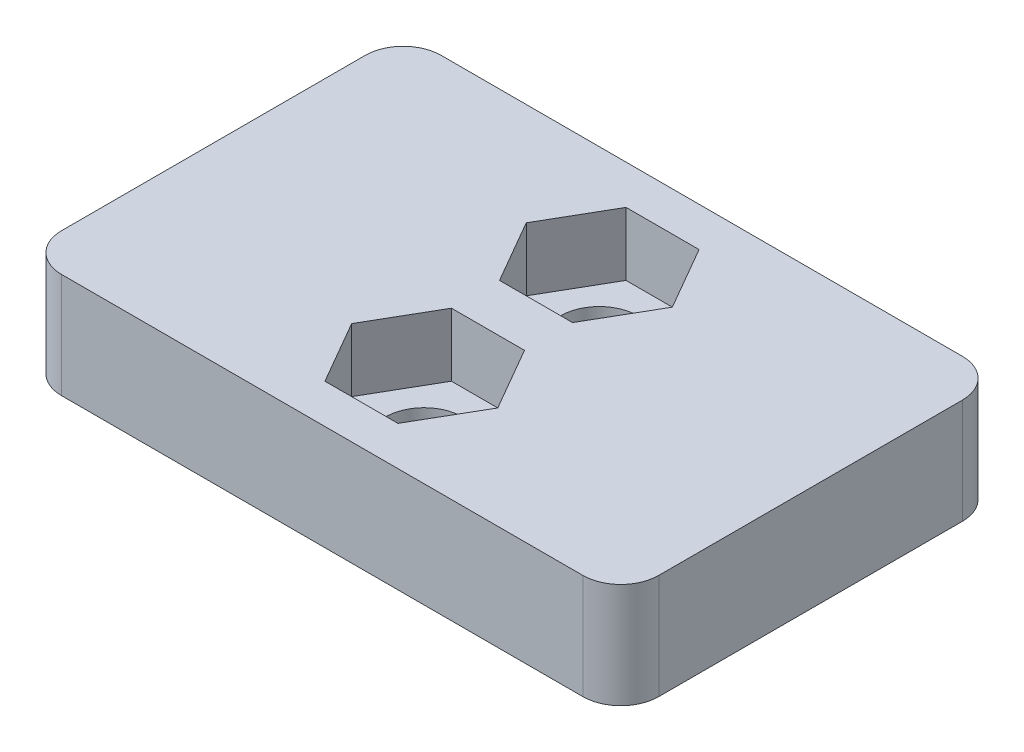
ISO-10303-21;
HEADER;
FILE_DESCRIPTION(('STEP AP214'),'2;1');
FILE_NAME('part.step','',(''),(''),'','','');
FILE_SCHEMA(('AUTOMOTIVE_DESIGN { 1 0 10303 214 1 1 1 1 }'));
ENDSEC;
DATA;
#1=APPLICATION_CONTEXT('core data for automotive mechanical design processes');
#2=APPLICATION_PROTOCOL_DEFINITION('international standard','automotive_design',2000,#1);
#3=PRODUCT_CONTEXT('',#1,'mechanical');
#4=PRODUCT('Part','Part','',(#3));
#5=PRODUCT_RELATED_PRODUCT_CATEGORY('part','',(#4));
#6=PRODUCT_DEFINITION_FORMATION('','',#4);
#7=PRODUCT_DEFINITION_CONTEXT('part definition',#1,'design');
#8=PRODUCT_DEFINITION('design','',#6,#7);
#9=PRODUCT_DEFINITION_SHAPE('','',#8);
#10=(LENGTH_UNIT() NAMED_UNIT(*) SI_UNIT(.MILLI.,.METRE.));
#11=(NAMED_UNIT(*) PLANE_ANGLE_UNIT() SI_UNIT($,.RADIAN.));
#12=(NAMED_UNIT(*) SI_UNIT($,.STERADIAN.) SOLID_ANGLE_UNIT());
#13=UNCERTAINTY_MEASURE_WITH_UNIT(LENGTH_MEASURE(1.E-05),#10,'distance_accuracy_value','');
#14=(GEOMETRIC_REPRESENTATION_CONTEXT(3) GLOBAL_UNCERTAINTY_ASSIGNED_CONTEXT((#13)) GLOBAL_UNIT_ASSIGNED_CONTEXT((#10,
#11,#12)) REPRESENTATION_CONTEXT('',''));
#15=CARTESIAN_POINT('',(0.,0.,0.));
#16=DIRECTION('',(0.,0.,1.));
#17=DIRECTION('',(1.,0.,0.));
#18=AXIS2_PLACEMENT_3D('',#15,#16,#17);
#19=CARTESIAN_POINT('',(8.74191809555234,23.2682509995502,30.));
#20=DIRECTION('',(1.,0.,0.));
#21=DIRECTION('',(0.,1.,0.));
#22=AXIS2_PLACEMENT_3D('',#19,#20,#21);
#23=PLANE('',#22);
#24=DIRECTION('',(0.,0.,-1.));
#25=VECTOR('',#24,1.);
#26=CARTESIAN_POINT('',(8.74191809555234,14.9682509995502,30.));
#27=LINE('',#26,#25);
#28=CARTESIAN_POINT('',(8.74191809555234,14.9682509995502,27.));
#29=VERTEX_POINT('',#28);
#30=CARTESIAN_POINT('',(8.74191809555234,14.9682509995502,3.));
#31=VERTEX_POINT('',#30);
#32=EDGE_CURVE('E405',#29,#31,#27,.T.);
#33=ORIENTED_EDGE('',*,*,#32,.F.);
#34=DIRECTION('',(0.,-1.,0.));
#35=VECTOR('',#34,1.);
#36=CARTESIAN_POINT('',(8.74191809555234,23.2682509995502,27.));
#37=LINE('',#36,#35);
#38=CARTESIAN_POINT('',(8.74191809555234,23.2682509995502,27.));
#39=VERTEX_POINT('',#38);
#40=EDGE_CURVE('E205',#29,#39,#37,.F.);
#41=ORIENTED_EDGE('',*,*,#40,.T.);
#42=DIRECTION('',(0.,0.,-1.));
#43=VECTOR('',#42,1.);
#44=CARTESIAN_POINT('',(8.74191809555234,23.2682509995502,30.));
#45=LINE('',#44,#43);
#46=CARTESIAN_POINT('',(8.74191809555234,23.2682509995502,3.));
#47=VERTEX_POINT('',#46);
#48=EDGE_CURVE('E258',#39,#47,#45,.T.);
#49=ORIENTED_EDGE('',*,*,#48,.T.);
#50=DIRECTION('',(0.,-1.,0.));
#51=VECTOR('',#50,1.);
#52=CARTESIAN_POINT('',(8.74191809555234,23.2682509995502,3.));
#53=LINE('',#52,#51);
#54=EDGE_CURVE('E196',#47,#31,#53,.T.);
#55=ORIENTED_EDGE('',*,*,#54,.T.);
#56=EDGE_LOOP('',(#33,#41,#49,#55));
#57=FACE_BOUND('',#56,.T.);
#58=ADVANCED_FACE('F39',(#57),#23,.F.);
#59=CARTESIAN_POINT('',(55.9419180955524,23.2682509995502,30.));
#60=DIRECTION('',(-1.,0.,0.));
#61=DIRECTION('',(0.,-1.,0.));
#62=AXIS2_PLACEMENT_3D('',#59,#60,#61);
#63=PLANE('',#62);
#64=DIRECTION('',(0.,0.,1.));
#65=VECTOR('',#64,1.);
#66=CARTESIAN_POINT('',(55.9419180955524,14.9682509995502,30.));
#67=LINE('',#66,#65);
#68=CARTESIAN_POINT('',(55.9419180955524,14.9682509995502,3.));
#69=VERTEX_POINT('',#68);
#70=CARTESIAN_POINT('',(55.9419180955524,14.9682509995502,27.));
#71=VERTEX_POINT('',#70);
#72=EDGE_CURVE('E177',#69,#71,#67,.T.);
#73=ORIENTED_EDGE('',*,*,#72,.F.);
#74=DIRECTION('',(0.,1.,0.));
#75=VECTOR('',#74,1.);
#76=CARTESIAN_POINT('',(55.9419180955524,23.2682509995502,3.));
#77=LINE('',#76,#75);
#78=CARTESIAN_POINT('',(55.9419180955524,23.2682509995502,3.));
#79=VERTEX_POINT('',#78);
#80=EDGE_CURVE('E62',#69,#79,#77,.T.);
#81=ORIENTED_EDGE('',*,*,#80,.T.);
#82=DIRECTION('',(0.,0.,-1.));
#83=VECTOR('',#82,1.);
#84=CARTESIAN_POINT('',(55.9419180955524,23.2682509995502,30.));
#85=LINE('',#84,#83);
#86=CARTESIAN_POINT('',(55.9419180955524,23.2682509995502,27.));
#87=VERTEX_POINT('',#86);
#88=EDGE_CURVE('E245',#87,#79,#85,.T.);
#89=ORIENTED_EDGE('',*,*,#88,.F.);
#90=DIRECTION('',(0.,1.,0.));
#91=VECTOR('',#90,1.);
#92=CARTESIAN_POINT('',(55.9419180955523,4.96825099955015,27.));
#93=LINE('',#92,#91);
#94=EDGE_CURVE('E185',#87,#71,#93,.F.);
#95=ORIENTED_EDGE('',*,*,#94,.T.);
#96=EDGE_LOOP('',(#73,#81,#89,#95));
#97=FACE_BOUND('',#96,.T.);
#98=ADVANCED_FACE('F183',(#97),#63,.F.);
#99=CARTESIAN_POINT('',(0.,0.,30.));
#100=DIRECTION('',(0.,0.,1.));
#101=DIRECTION('',(1.,0.,0.));
#102=AXIS2_PLACEMENT_3D('',#99,#100,#101);
#103=PLANE('',#102);
#104=DIRECTION('',(0.,-1.,0.));
#105=VECTOR('',#104,1.);
#106=CARTESIAN_POINT('',(11.7419180955523,4.96825099955015,30.));
#107=LINE('',#106,#105);
#108=CARTESIAN_POINT('',(11.7419180955523,23.2682509995502,30.));
#109=VERTEX_POINT('',#108);
#110=CARTESIAN_POINT('',(11.7419180955523,14.9682509995502,30.));
#111=VERTEX_POINT('',#110);
#112=EDGE_CURVE('E241',#109,#111,#107,.T.);
#113=ORIENTED_EDGE('',*,*,#112,.T.);
#114=DIRECTION('',(1.,0.,0.));
#115=VECTOR('',#114,1.);
#116=CARTESIAN_POINT('',(0.,14.9682509995502,30.));
#117=LINE('',#116,#115);
#118=CARTESIAN_POINT('',(52.9419180955523,14.9682509995502,30.));
#119=VERTEX_POINT('',#118);
#120=EDGE_CURVE('E408',#111,#119,#117,.T.);
#121=ORIENTED_EDGE('',*,*,#120,.T.);
#122=DIRECTION('',(0.,1.,0.));
#123=VECTOR('',#122,1.);
#124=CARTESIAN_POINT('',(52.9419180955523,23.2682509995502,30.));
#125=LINE('',#124,#123);
#126=CARTESIAN_POINT('',(52.9419180955523,23.2682509995502,30.));
#127=VERTEX_POINT('',#126);
#128=EDGE_CURVE('E236',#119,#127,#125,.T.);
#129=ORIENTED_EDGE('',*,*,#128,.T.);
#130=DIRECTION('',(-1.,0.,0.));
#131=VECTOR('',#130,1.);
#132=CARTESIAN_POINT('',(8.74191809555234,23.2682509995502,30.));
#133=LINE('',#132,#131);
#134=EDGE_CURVE('E227',#127,#109,#133,.T.);
#135=ORIENTED_EDGE('',*,*,#134,.T.);
#136=EDGE_LOOP('',(#113,#121,#129,#135));
#137=FACE_BOUND('',#136,.T.);
#138=ADVANCED_FACE('F426',(#137),#103,.T.);
#139=CARTESIAN_POINT('',(0.,0.,0.));
#140=DIRECTION('',(0.,0.,1.));
#141=DIRECTION('',(1.,0.,0.));
#142=AXIS2_PLACEMENT_3D('',#139,#140,#141);
#143=PLANE('',#142);
#144=DIRECTION('',(1.,0.,0.));
#145=VECTOR('',#144,1.);
#146=CARTESIAN_POINT('',(0.,14.9682509995502,0.));
#147=LINE('',#146,#145);
#148=CARTESIAN_POINT('',(11.7419180955523,14.9682509995502,0.));
#149=VERTEX_POINT('',#148);
#150=CARTESIAN_POINT('',(52.9419180955523,14.9682509995502,0.));
#151=VERTEX_POINT('',#150);
#152=EDGE_CURVE('E55',#149,#151,#147,.T.);
#153=ORIENTED_EDGE('',*,*,#152,.F.);
#154=DIRECTION('',(0.,-1.,0.));
#155=VECTOR('',#154,1.);
#156=CARTESIAN_POINT('',(11.7419180955523,0.,0.));
#157=LINE('',#156,#155);
#158=CARTESIAN_POINT('',(11.7419180955523,23.2682509995502,0.));
#159=VERTEX_POINT('',#158);
#160=EDGE_CURVE('E48',#149,#159,#157,.F.);
#161=ORIENTED_EDGE('',*,*,#160,.T.);
#162=DIRECTION('',(-1.,0.,0.));
#163=VECTOR('',#162,1.);
#164=CARTESIAN_POINT('',(8.74191809555234,23.2682509995502,0.));
#165=LINE('',#164,#163);
#166=CARTESIAN_POINT('',(52.9419180955523,23.2682509995502,0.));
#167=VERTEX_POINT('',#166);
#168=EDGE_CURVE('E216',#167,#159,#165,.T.);
#169=ORIENTED_EDGE('',*,*,#168,.F.);
#170=DIRECTION('',(0.,1.,0.));
#171=VECTOR('',#170,1.);
#172=CARTESIAN_POINT('',(52.9419180955523,0.,0.));
#173=LINE('',#172,#171);
#174=EDGE_CURVE('E208',#167,#151,#173,.F.);
#175=ORIENTED_EDGE('',*,*,#174,.T.);
#176=EDGE_LOOP('',(#153,#161,#169,#175));
#177=FACE_BOUND('',#176,.T.);
#178=ADVANCED_FACE('F215',(#177),#143,.F.);
#179=CARTESIAN_POINT('',(32.3419039644914,-5.73174900044985,8.10001615313241));
#180=DIRECTION('',(0.,1.,0.));
#181=DIRECTION('',(0.,0.,1.));
#182=AXIS2_PLACEMENT_3D('',#179,#180,#181);
#183=CYLINDRICAL_SURFACE('',#182,3.05);
#184=CARTESIAN_POINT('',(32.3419039644914,18.2682509995502,8.10001615313241));
#185=DIRECTION('',(0.,1.,0.));
#186=DIRECTION('',(0.,0.,1.));
#187=AXIS2_PLACEMENT_3D('',#184,#185,#186);
#188=CIRCLE('',#187,3.05);
#189=CARTESIAN_POINT('',(32.3419039644914,18.2682509995502,11.1500161531324));
#190=VERTEX_POINT('',#189);
#191=EDGE_CURVE('E251',#190,#190,#188,.T.);
#192=ORIENTED_EDGE('',*,*,#191,.T.);
#193=EDGE_LOOP('',(#192));
#194=FACE_BOUND('',#193,.T.);
#195=CARTESIAN_POINT('',(32.3419039644914,14.9682509995502,8.10001615313241));
#196=DIRECTION('',(0.,-1.,0.));
#197=DIRECTION('',(0.,0.,-1.));
#198=AXIS2_PLACEMENT_3D('',#195,#196,#197);
#199=CIRCLE('',#198,3.05);
#200=CARTESIAN_POINT('',(32.3419039644914,14.9682509995502,5.05001615313241));
#201=VERTEX_POINT('',#200);
#202=EDGE_CURVE('E255',#201,#201,#199,.F.);
#203=ORIENTED_EDGE('',*,*,#202,.F.);
#204=EDGE_LOOP('',(#203));
#205=FACE_BOUND('',#204,.T.);
#206=ADVANCED_FACE('F439',(#194,#205),#183,.F.);
#207=CARTESIAN_POINT('',(32.3419039644914,-5.73174900044985,21.95));
#208=DIRECTION('',(0.,1.,0.));
#209=DIRECTION('',(0.,0.,1.));
#210=AXIS2_PLACEMENT_3D('',#207,#208,#209);
#211=CYLINDRICAL_SURFACE('',#210,3.05);
#212=CARTESIAN_POINT('',(32.3419039644914,18.2682509995502,21.95));
#213=DIRECTION('',(0.,1.,0.));
#214=DIRECTION('',(0.,0.,1.));
#215=AXIS2_PLACEMENT_3D('',#212,#213,#214);
#216=CIRCLE('',#215,3.05);
#217=CARTESIAN_POINT('',(32.3419039644914,18.2682509995502,25.));
#218=VERTEX_POINT('',#217);
#219=EDGE_CURVE('E246',#218,#218,#216,.T.);
#220=ORIENTED_EDGE('',*,*,#219,.T.);
#221=EDGE_LOOP('',(#220));
#222=FACE_BOUND('',#221,.T.);
#223=CARTESIAN_POINT('',(32.3419039644914,14.9682509995502,21.95));
#224=DIRECTION('',(0.,-1.,0.));
#225=DIRECTION('',(0.,0.,-1.));
#226=AXIS2_PLACEMENT_3D('',#223,#224,#225);
#227=CIRCLE('',#226,3.05);
#228=CARTESIAN_POINT('',(32.3419039644914,14.9682509995502,18.9));
#229=VERTEX_POINT('',#228);
#230=EDGE_CURVE('E397',#229,#229,#227,.F.);
#231=ORIENTED_EDGE('',*,*,#230,.F.);
#232=EDGE_LOOP('',(#231));
#233=FACE_BOUND('',#232,.T.);
#234=ADVANCED_FACE('F432',(#222,#233),#211,.F.);
#235=CARTESIAN_POINT('',(52.9419180955523,0.,27.));
#236=DIRECTION('',(0.,-1.,0.));
#237=DIRECTION('',(1.,0.,0.));
#238=AXIS2_PLACEMENT_3D('',#235,#236,#237);
#239=CYLINDRICAL_SURFACE('',#238,3.);
#240=ORIENTED_EDGE('',*,*,#128,.F.);
#241=CARTESIAN_POINT('',(52.9419180955523,14.9682509995502,27.));
#242=DIRECTION('',(0.,-1.,0.));
#243=DIRECTION('',(0.,0.,-1.));
#244=AXIS2_PLACEMENT_3D('',#241,#242,#243);
#245=CIRCLE('',#244,3.);
#246=EDGE_CURVE('E412',#119,#71,#245,.F.);
#247=ORIENTED_EDGE('',*,*,#246,.T.);
#248=ORIENTED_EDGE('',*,*,#94,.F.);
#249=CARTESIAN_POINT('',(52.9419180955523,23.2682509995502,27.));
#250=DIRECTION('',(0.,-1.,0.));
#251=DIRECTION('',(0.,0.,-1.));
#252=AXIS2_PLACEMENT_3D('',#249,#250,#251);
#253=CIRCLE('',#252,3.);
#254=EDGE_CURVE('E192',#127,#87,#253,.F.);
#255=ORIENTED_EDGE('',*,*,#254,.F.);
#256=EDGE_LOOP('',(#240,#247,#248,#255));
#257=FACE_BOUND('',#256,.T.);
#258=ADVANCED_FACE('F430',(#257),#239,.T.);
#259=CARTESIAN_POINT('',(11.7419180955523,0.,27.));
#260=DIRECTION('',(0.,1.,0.));
#261=DIRECTION('',(-1.,0.,0.));
#262=AXIS2_PLACEMENT_3D('',#259,#260,#261);
#263=CYLINDRICAL_SURFACE('',#262,3.);
#264=ORIENTED_EDGE('',*,*,#40,.F.);
#265=CARTESIAN_POINT('',(11.7419180955523,14.9682509995502,27.));
#266=DIRECTION('',(0.,-1.,0.));
#267=DIRECTION('',(0.,0.,-1.));
#268=AXIS2_PLACEMENT_3D('',#265,#266,#267);
#269=CIRCLE('',#268,3.);
#270=EDGE_CURVE('E401',#29,#111,#269,.F.);
#271=ORIENTED_EDGE('',*,*,#270,.T.);
#272=ORIENTED_EDGE('',*,*,#112,.F.);
#273=CARTESIAN_POINT('',(11.7419180955523,23.2682509995502,27.));
#274=DIRECTION('',(0.,-1.,0.));
#275=DIRECTION('',(0.,0.,-1.));
#276=AXIS2_PLACEMENT_3D('',#273,#274,#275);
#277=CIRCLE('',#276,3.);
#278=EDGE_CURVE('E198',#39,#109,#277,.F.);
#279=ORIENTED_EDGE('',*,*,#278,.F.);
#280=EDGE_LOOP('',(#264,#271,#272,#279));
#281=FACE_BOUND('',#280,.T.);
#282=ADVANCED_FACE('F424',(#281),#263,.T.);
#283=CARTESIAN_POINT('',(11.7419180955523,23.2682509995502,3.));
#284=DIRECTION('',(0.,-1.,0.));
#285=DIRECTION('',(1.,0.,0.));
#286=AXIS2_PLACEMENT_3D('',#283,#284,#285);
#287=CYLINDRICAL_SURFACE('',#286,3.);
#288=ORIENTED_EDGE('',*,*,#160,.F.);
#289=CARTESIAN_POINT('',(11.7419180955523,14.9682509995502,3.));
#290=DIRECTION('',(0.,-1.,0.));
#291=DIRECTION('',(0.,0.,-1.));
#292=AXIS2_PLACEMENT_3D('',#289,#290,#291);
#293=CIRCLE('',#292,3.);
#294=EDGE_CURVE('E187',#149,#31,#293,.F.);
#295=ORIENTED_EDGE('',*,*,#294,.T.);
#296=ORIENTED_EDGE('',*,*,#54,.F.);
#297=CARTESIAN_POINT('',(11.7419180955523,23.2682509995502,3.));
#298=DIRECTION('',(0.,-1.,0.));
#299=DIRECTION('',(0.,0.,-1.));
#300=AXIS2_PLACEMENT_3D('',#297,#298,#299);
#301=CIRCLE('',#300,3.);
#302=EDGE_CURVE('E224',#159,#47,#301,.F.);
#303=ORIENTED_EDGE('',*,*,#302,.F.);
#304=EDGE_LOOP('',(#288,#295,#296,#303));
#305=FACE_BOUND('',#304,.T.);
#306=ADVANCED_FACE('F231',(#305),#287,.T.);
#307=CARTESIAN_POINT('',(52.9419180955523,23.2682509995502,3.));
#308=DIRECTION('',(0.,1.,0.));
#309=DIRECTION('',(-1.,0.,0.));
#310=AXIS2_PLACEMENT_3D('',#307,#308,#309);
#311=CYLINDRICAL_SURFACE('',#310,3.);
#312=ORIENTED_EDGE('',*,*,#80,.F.);
#313=CARTESIAN_POINT('',(52.9419180955523,14.9682509995502,3.));
#314=DIRECTION('',(0.,-1.,0.));
#315=DIRECTION('',(0.,0.,-1.));
#316=AXIS2_PLACEMENT_3D('',#313,#314,#315);
#317=CIRCLE('',#316,3.);
#318=EDGE_CURVE('E11',#69,#151,#317,.F.);
#319=ORIENTED_EDGE('',*,*,#318,.T.);
#320=ORIENTED_EDGE('',*,*,#174,.F.);
#321=CARTESIAN_POINT('',(52.9419180955523,23.2682509995502,3.));
#322=DIRECTION('',(0.,-1.,0.));
#323=DIRECTION('',(0.,0.,-1.));
#324=AXIS2_PLACEMENT_3D('',#321,#322,#323);
#325=CIRCLE('',#324,3.);
#326=EDGE_CURVE('E189',#79,#167,#325,.F.);
#327=ORIENTED_EDGE('',*,*,#326,.F.);
#328=EDGE_LOOP('',(#312,#319,#320,#327));
#329=FACE_BOUND('',#328,.T.);
#330=ADVANCED_FACE('F41',(#329),#311,.T.);
#331=CARTESIAN_POINT('',(8.74191809555234,23.2682509995502,30.));
#332=DIRECTION('',(0.,-1.,0.));
#333=DIRECTION('',(0.,0.,-1.));
#334=AXIS2_PLACEMENT_3D('',#331,#332,#333);
#335=PLANE('',#334);
#336=DIRECTION('',(-0.500000000000001,0.,-0.866025403784438));
#337=VECTOR('',#336,1.);
#338=CARTESIAN_POINT('',(38.1154207874486,23.2682509995502,8.10000000000001));
#339=LINE('',#338,#337);
#340=CARTESIAN_POINT('',(38.1154207874486,23.2682509995502,8.10000000000001));
#341=VERTEX_POINT('',#340);
#342=CARTESIAN_POINT('',(35.2286694415005,23.2682509995502,3.1));
#343=VERTEX_POINT('',#342);
#344=EDGE_CURVE('E366',#341,#343,#339,.T.);
#345=ORIENTED_EDGE('',*,*,#344,.F.);
#346=DIRECTION('',(0.5,0.,-0.866025403784439));
#347=VECTOR('',#346,1.);
#348=CARTESIAN_POINT('',(35.2286694415005,23.2682509995502,13.1));
#349=LINE('',#348,#347);
#350=CARTESIAN_POINT('',(35.2286694415005,23.2682509995502,13.1));
#351=VERTEX_POINT('',#350);
#352=EDGE_CURVE('E284',#351,#341,#349,.T.);
#353=ORIENTED_EDGE('',*,*,#352,.F.);
#354=DIRECTION('',(1.,0.,0.));
#355=VECTOR('',#354,1.);
#356=CARTESIAN_POINT('',(29.4551667496042,23.2682509995502,13.1));
#357=LINE('',#356,#355);
#358=CARTESIAN_POINT('',(29.4551667496042,23.2682509995502,13.1));
#359=VERTEX_POINT('',#358);
#360=EDGE_CURVE('E349',#359,#351,#357,.T.);
#361=ORIENTED_EDGE('',*,*,#360,.F.);
#362=DIRECTION('',(0.5,0.,0.866025403784438));
#363=VECTOR('',#362,1.);
#364=CARTESIAN_POINT('',(26.5684154036561,23.2682509995502,8.1));
#365=LINE('',#364,#363);
#366=CARTESIAN_POINT('',(26.5684154036561,23.2682509995502,8.1));
#367=VERTEX_POINT('',#366);
#368=EDGE_CURVE('E354',#367,#359,#365,.T.);
#369=ORIENTED_EDGE('',*,*,#368,.F.);
#370=DIRECTION('',(-0.5,0.,0.866025403784438));
#371=VECTOR('',#370,1.);
#372=CARTESIAN_POINT('',(29.4551667496042,23.2682509995502,3.1));
#373=LINE('',#372,#371);
#374=CARTESIAN_POINT('',(29.4551667496042,23.2682509995502,3.1));
#375=VERTEX_POINT('',#374);
#376=EDGE_CURVE('E358',#375,#367,#373,.T.);
#377=ORIENTED_EDGE('',*,*,#376,.F.);
#378=DIRECTION('',(-1.,0.,0.));
#379=VECTOR('',#378,1.);
#380=CARTESIAN_POINT('',(35.2286694415005,23.2682509995502,3.1));
#381=LINE('',#380,#379);
#382=EDGE_CURVE('E362',#343,#375,#381,.T.);
#383=ORIENTED_EDGE('',*,*,#382,.F.);
#384=EDGE_LOOP('',(#345,#353,#361,#369,#377,#383));
#385=FACE_BOUND('',#384,.T.);
#386=DIRECTION('',(-0.500000000000001,0.,-0.866025403784438));
#387=VECTOR('',#386,1.);
#388=CARTESIAN_POINT('',(38.1154207874486,23.2682509995502,21.9));
#389=LINE('',#388,#387);
#390=CARTESIAN_POINT('',(38.1154207874486,23.2682509995502,21.9));
#391=VERTEX_POINT('',#390);
#392=CARTESIAN_POINT('',(35.2286694415005,23.2682509995502,16.9));
#393=VERTEX_POINT('',#392);
#394=EDGE_CURVE('E302',#391,#393,#389,.T.);
#395=ORIENTED_EDGE('',*,*,#394,.F.);
#396=DIRECTION('',(0.5,0.,-0.866025403784439));
#397=VECTOR('',#396,1.);
#398=CARTESIAN_POINT('',(35.2286694415005,23.2682509995502,26.9));
#399=LINE('',#398,#397);
#400=CARTESIAN_POINT('',(35.2286694415005,23.2682509995502,26.9));
#401=VERTEX_POINT('',#400);
#402=EDGE_CURVE('E250',#401,#391,#399,.T.);
#403=ORIENTED_EDGE('',*,*,#402,.F.);
#404=DIRECTION('',(1.,0.,0.));
#405=VECTOR('',#404,1.);
#406=CARTESIAN_POINT('',(29.4551667496042,23.2682509995502,26.9));
#407=LINE('',#406,#405);
#408=CARTESIAN_POINT('',(29.4551667496042,23.2682509995502,26.9));
#409=VERTEX_POINT('',#408);
#410=EDGE_CURVE('E285',#409,#401,#407,.T.);
#411=ORIENTED_EDGE('',*,*,#410,.F.);
#412=DIRECTION('',(0.5,0.,0.866025403784439));
#413=VECTOR('',#412,1.);
#414=CARTESIAN_POINT('',(26.5684154036561,23.2682509995502,21.9));
#415=LINE('',#414,#413);
#416=CARTESIAN_POINT('',(26.5684154036561,23.2682509995502,21.9));
#417=VERTEX_POINT('',#416);
#418=EDGE_CURVE('E290',#417,#409,#415,.T.);
#419=ORIENTED_EDGE('',*,*,#418,.F.);
#420=DIRECTION('',(-0.5,0.,0.866025403784438));
#421=VECTOR('',#420,1.);
#422=CARTESIAN_POINT('',(29.4551667496042,23.2682509995502,16.9));
#423=LINE('',#422,#421);
#424=CARTESIAN_POINT('',(29.4551667496042,23.2682509995502,16.9));
#425=VERTEX_POINT('',#424);
#426=EDGE_CURVE('E294',#425,#417,#423,.T.);
#427=ORIENTED_EDGE('',*,*,#426,.F.);
#428=DIRECTION('',(-1.,0.,0.));
#429=VECTOR('',#428,1.);
#430=CARTESIAN_POINT('',(35.2286694415005,23.2682509995502,16.9));
#431=LINE('',#430,#429);
#432=EDGE_CURVE('E298',#393,#425,#431,.T.);
#433=ORIENTED_EDGE('',*,*,#432,.F.);
#434=EDGE_LOOP('',(#395,#403,#411,#419,#427,#433));
#435=FACE_BOUND('',#434,.T.);
#436=ORIENTED_EDGE('',*,*,#134,.F.);
#437=ORIENTED_EDGE('',*,*,#254,.T.);
#438=ORIENTED_EDGE('',*,*,#88,.T.);
#439=ORIENTED_EDGE('',*,*,#326,.T.);
#440=ORIENTED_EDGE('',*,*,#168,.T.);
#441=ORIENTED_EDGE('',*,*,#302,.T.);
#442=ORIENTED_EDGE('',*,*,#48,.F.);
#443=ORIENTED_EDGE('',*,*,#278,.T.);
#444=EDGE_LOOP('',(#436,#437,#438,#439,#440,#441,#442,#443));
#445=FACE_BOUND('',#444,.T.);
#446=ADVANCED_FACE('F222',(#385,#435,#445),#335,.F.);
#447=CARTESIAN_POINT('',(35.2286694415005,18.2682509995502,26.9));
#448=DIRECTION('',(0.866025403784439,0.,0.5));
#449=DIRECTION('',(0.5,0.,-0.866025403784439));
#450=AXIS2_PLACEMENT_3D('',#447,#448,#449);
#451=PLANE('',#450);
#452=ORIENTED_EDGE('',*,*,#402,.T.);
#453=DIRECTION('',(0.,1.,0.));
#454=VECTOR('',#453,1.);
#455=CARTESIAN_POINT('',(38.1154207874486,18.2682509995502,21.9));
#456=LINE('',#455,#454);
#457=CARTESIAN_POINT('',(38.1154207874486,18.2682509995502,21.9));
#458=VERTEX_POINT('',#457);
#459=EDGE_CURVE('E264',#458,#391,#456,.T.);
#460=ORIENTED_EDGE('',*,*,#459,.F.);
#461=DIRECTION('',(0.5,0.,-0.866025403784439));
#462=VECTOR('',#461,1.);
#463=CARTESIAN_POINT('',(35.2286694415005,18.2682509995502,26.9));
#464=LINE('',#463,#462);
#465=CARTESIAN_POINT('',(35.2286694415005,18.2682509995502,26.9));
#466=VERTEX_POINT('',#465);
#467=EDGE_CURVE('E289',#466,#458,#464,.T.);
#468=ORIENTED_EDGE('',*,*,#467,.F.);
#469=DIRECTION('',(0.,1.,0.));
#470=VECTOR('',#469,1.);
#471=CARTESIAN_POINT('',(35.2286694415005,18.2682509995502,26.9));
#472=LINE('',#471,#470);
#473=EDGE_CURVE('E281',#466,#401,#472,.T.);
#474=ORIENTED_EDGE('',*,*,#473,.T.);
#475=EDGE_LOOP('',(#452,#460,#468,#474));
#476=FACE_BOUND('',#475,.T.);
#477=ADVANCED_FACE('F451',(#476),#451,.F.);
#478=CARTESIAN_POINT('',(29.4551667496042,18.2682509995502,26.9));
#479=DIRECTION('',(0.,0.,1.));
#480=DIRECTION('',(1.,0.,0.));
#481=AXIS2_PLACEMENT_3D('',#478,#479,#480);
#482=PLANE('',#481);
#483=ORIENTED_EDGE('',*,*,#410,.T.);
#484=ORIENTED_EDGE('',*,*,#473,.F.);
#485=DIRECTION('',(1.,0.,0.));
#486=VECTOR('',#485,1.);
#487=CARTESIAN_POINT('',(29.4551667496042,18.2682509995502,26.9));
#488=LINE('',#487,#486);
#489=CARTESIAN_POINT('',(29.4551667496042,18.2682509995502,26.9));
#490=VERTEX_POINT('',#489);
#491=EDGE_CURVE('E269',#490,#466,#488,.T.);
#492=ORIENTED_EDGE('',*,*,#491,.F.);
#493=DIRECTION('',(0.,1.,0.));
#494=VECTOR('',#493,1.);
#495=CARTESIAN_POINT('',(29.4551667496042,18.2682509995502,26.9));
#496=LINE('',#495,#494);
#497=EDGE_CURVE('E278',#490,#409,#496,.T.);
#498=ORIENTED_EDGE('',*,*,#497,.T.);
#499=EDGE_LOOP('',(#483,#484,#492,#498));
#500=FACE_BOUND('',#499,.T.);
#501=ADVANCED_FACE('F459',(#500),#482,.F.);
#502=CARTESIAN_POINT('',(26.5684154036561,18.2682509995502,21.9));
#503=DIRECTION('',(-0.866025403784438,0.,0.5));
#504=DIRECTION('',(0.5,0.,0.866025403784439));
#505=AXIS2_PLACEMENT_3D('',#502,#503,#504);
#506=PLANE('',#505);
#507=ORIENTED_EDGE('',*,*,#418,.T.);
#508=ORIENTED_EDGE('',*,*,#497,.F.);
#509=DIRECTION('',(0.5,0.,0.866025403784439));
#510=VECTOR('',#509,1.);
#511=CARTESIAN_POINT('',(26.5684154036561,18.2682509995502,21.9));
#512=LINE('',#511,#510);
#513=CARTESIAN_POINT('',(26.5684154036561,18.2682509995502,21.9));
#514=VERTEX_POINT('',#513);
#515=EDGE_CURVE('E311',#514,#490,#512,.T.);
#516=ORIENTED_EDGE('',*,*,#515,.F.);
#517=DIRECTION('',(0.,1.,0.));
#518=VECTOR('',#517,1.);
#519=CARTESIAN_POINT('',(26.5684154036561,18.2682509995502,21.9));
#520=LINE('',#519,#518);
#521=EDGE_CURVE('E275',#514,#417,#520,.T.);
#522=ORIENTED_EDGE('',*,*,#521,.T.);
#523=EDGE_LOOP('',(#507,#508,#516,#522));
#524=FACE_BOUND('',#523,.T.);
#525=ADVANCED_FACE('F473',(#524),#506,.F.);
#526=CARTESIAN_POINT('',(29.4551667496042,18.2682509995502,16.9));
#527=DIRECTION('',(-0.866025403784438,0.,-0.5));
#528=DIRECTION('',(-0.5,0.,0.866025403784438));
#529=AXIS2_PLACEMENT_3D('',#526,#527,#528);
#530=PLANE('',#529);
#531=ORIENTED_EDGE('',*,*,#426,.T.);
#532=ORIENTED_EDGE('',*,*,#521,.F.);
#533=DIRECTION('',(-0.5,0.,0.866025403784438));
#534=VECTOR('',#533,1.);
#535=CARTESIAN_POINT('',(29.4551667496042,18.2682509995502,16.9));
#536=LINE('',#535,#534);
#537=CARTESIAN_POINT('',(29.4551667496042,18.2682509995502,16.9));
#538=VERTEX_POINT('',#537);
#539=EDGE_CURVE('E315',#538,#514,#536,.T.);
#540=ORIENTED_EDGE('',*,*,#539,.F.);
#541=DIRECTION('',(0.,1.,0.));
#542=VECTOR('',#541,1.);
#543=CARTESIAN_POINT('',(29.4551667496042,18.2682509995502,16.9));
#544=LINE('',#543,#542);
#545=EDGE_CURVE('E272',#538,#425,#544,.T.);
#546=ORIENTED_EDGE('',*,*,#545,.T.);
#547=EDGE_LOOP('',(#531,#532,#540,#546));
#548=FACE_BOUND('',#547,.T.);
#549=ADVANCED_FACE('F469',(#548),#530,.F.);
#550=CARTESIAN_POINT('',(35.2286694415005,18.2682509995502,16.9));
#551=DIRECTION('',(0.,0.,-1.));
#552=DIRECTION('',(-1.,0.,0.));
#553=AXIS2_PLACEMENT_3D('',#550,#551,#552);
#554=PLANE('',#553);
#555=ORIENTED_EDGE('',*,*,#432,.T.);
#556=ORIENTED_EDGE('',*,*,#545,.F.);
#557=DIRECTION('',(-1.,0.,0.));
#558=VECTOR('',#557,1.);
#559=CARTESIAN_POINT('',(35.2286694415005,18.2682509995502,16.9));
#560=LINE('',#559,#558);
#561=CARTESIAN_POINT('',(35.2286694415005,18.2682509995502,16.9));
#562=VERTEX_POINT('',#561);
#563=EDGE_CURVE('E319',#562,#538,#560,.T.);
#564=ORIENTED_EDGE('',*,*,#563,.F.);
#565=DIRECTION('',(0.,1.,0.));
#566=VECTOR('',#565,1.);
#567=CARTESIAN_POINT('',(35.2286694415005,18.2682509995502,16.9));
#568=LINE('',#567,#566);
#569=EDGE_CURVE('E268',#562,#393,#568,.T.);
#570=ORIENTED_EDGE('',*,*,#569,.T.);
#571=EDGE_LOOP('',(#555,#556,#564,#570));
#572=FACE_BOUND('',#571,.T.);
#573=ADVANCED_FACE('F465',(#572),#554,.F.);
#574=CARTESIAN_POINT('',(38.1154207874486,18.2682509995502,21.9));
#575=DIRECTION('',(0.866025403784438,0.,-0.500000000000001));
#576=DIRECTION('',(-0.500000000000001,0.,-0.866025403784438));
#577=AXIS2_PLACEMENT_3D('',#574,#575,#576);
#578=PLANE('',#577);
#579=ORIENTED_EDGE('',*,*,#394,.T.);
#580=ORIENTED_EDGE('',*,*,#569,.F.);
#581=DIRECTION('',(-0.500000000000001,0.,-0.866025403784438));
#582=VECTOR('',#581,1.);
#583=CARTESIAN_POINT('',(38.1154207874486,18.2682509995502,21.9));
#584=LINE('',#583,#582);
#585=EDGE_CURVE('E323',#458,#562,#584,.T.);
#586=ORIENTED_EDGE('',*,*,#585,.F.);
#587=ORIENTED_EDGE('',*,*,#459,.T.);
#588=EDGE_LOOP('',(#579,#580,#586,#587));
#589=FACE_BOUND('',#588,.T.);
#590=ADVANCED_FACE('F461',(#589),#578,.F.);
#591=CARTESIAN_POINT('',(0.,18.2682509995502,0.));
#592=DIRECTION('',(0.,1.,0.));
#593=DIRECTION('',(0.,0.,1.));
#594=AXIS2_PLACEMENT_3D('',#591,#592,#593);
#595=PLANE('',#594);
#596=ORIENTED_EDGE('',*,*,#219,.F.);
#597=EDGE_LOOP('',(#596));
#598=FACE_BOUND('',#597,.T.);
#599=ORIENTED_EDGE('',*,*,#467,.T.);
#600=ORIENTED_EDGE('',*,*,#585,.T.);
#601=ORIENTED_EDGE('',*,*,#563,.T.);
#602=ORIENTED_EDGE('',*,*,#539,.T.);
#603=ORIENTED_EDGE('',*,*,#515,.T.);
#604=ORIENTED_EDGE('',*,*,#491,.T.);
#605=EDGE_LOOP('',(#599,#600,#601,#602,#603,#604));
#606=FACE_BOUND('',#605,.T.);
#607=ADVANCED_FACE('F464',(#598,#606),#595,.T.);
#608=CARTESIAN_POINT('',(35.2286694415005,18.2682509995502,13.1));
#609=DIRECTION('',(0.866025403784439,0.,0.5));
#610=DIRECTION('',(0.5,0.,-0.866025403784439));
#611=AXIS2_PLACEMENT_3D('',#608,#609,#610);
#612=PLANE('',#611);
#613=ORIENTED_EDGE('',*,*,#352,.T.);
#614=DIRECTION('',(0.,1.,0.));
#615=VECTOR('',#614,1.);
#616=CARTESIAN_POINT('',(38.1154207874486,18.2682509995502,8.10000000000001));
#617=LINE('',#616,#615);
#618=CARTESIAN_POINT('',(38.1154207874486,18.2682509995502,8.10000000000001));
#619=VERTEX_POINT('',#618);
#620=EDGE_CURVE('E330',#619,#341,#617,.T.);
#621=ORIENTED_EDGE('',*,*,#620,.F.);
#622=DIRECTION('',(0.5,0.,-0.866025403784439));
#623=VECTOR('',#622,1.);
#624=CARTESIAN_POINT('',(35.2286694415005,18.2682509995502,13.1));
#625=LINE('',#624,#623);
#626=CARTESIAN_POINT('',(35.2286694415005,18.2682509995502,13.1));
#627=VERTEX_POINT('',#626);
#628=EDGE_CURVE('E353',#627,#619,#625,.T.);
#629=ORIENTED_EDGE('',*,*,#628,.F.);
#630=DIRECTION('',(0.,1.,0.));
#631=VECTOR('',#630,1.);
#632=CARTESIAN_POINT('',(35.2286694415005,18.2682509995502,13.1));
#633=LINE('',#632,#631);
#634=EDGE_CURVE('E228',#627,#351,#633,.T.);
#635=ORIENTED_EDGE('',*,*,#634,.T.);
#636=EDGE_LOOP('',(#613,#621,#629,#635));
#637=FACE_BOUND('',#636,.T.);
#638=ADVANCED_FACE('F483',(#637),#612,.F.);
#639=CARTESIAN_POINT('',(29.4551667496042,18.2682509995502,13.1));
#640=DIRECTION('',(0.,0.,1.));
#641=DIRECTION('',(1.,0.,0.));
#642=AXIS2_PLACEMENT_3D('',#639,#640,#641);
#643=PLANE('',#642);
#644=ORIENTED_EDGE('',*,*,#360,.T.);
#645=ORIENTED_EDGE('',*,*,#634,.F.);
#646=DIRECTION('',(1.,0.,0.));
#647=VECTOR('',#646,1.);
#648=CARTESIAN_POINT('',(29.4551667496042,18.2682509995502,13.1));
#649=LINE('',#648,#647);
#650=CARTESIAN_POINT('',(29.4551667496042,18.2682509995502,13.1));
#651=VERTEX_POINT('',#650);
#652=EDGE_CURVE('E335',#651,#627,#649,.T.);
#653=ORIENTED_EDGE('',*,*,#652,.F.);
#654=DIRECTION('',(0.,1.,0.));
#655=VECTOR('',#654,1.);
#656=CARTESIAN_POINT('',(29.4551667496042,18.2682509995502,13.1));
#657=LINE('',#656,#655);
#658=EDGE_CURVE('E344',#651,#359,#657,.T.);
#659=ORIENTED_EDGE('',*,*,#658,.T.);
#660=EDGE_LOOP('',(#644,#645,#653,#659));
#661=FACE_BOUND('',#660,.T.);
#662=ADVANCED_FACE('F487',(#661),#643,.F.);
#663=CARTESIAN_POINT('',(26.5684154036561,18.2682509995502,8.1));
#664=DIRECTION('',(-0.866025403784438,0.,0.5));
#665=DIRECTION('',(0.5,0.,0.866025403784438));
#666=AXIS2_PLACEMENT_3D('',#663,#664,#665);
#667=PLANE('',#666);
#668=ORIENTED_EDGE('',*,*,#368,.T.);
#669=ORIENTED_EDGE('',*,*,#658,.F.);
#670=DIRECTION('',(0.5,0.,0.866025403784438));
#671=VECTOR('',#670,1.);
#672=CARTESIAN_POINT('',(26.5684154036561,18.2682509995502,8.1));
#673=LINE('',#672,#671);
#674=CARTESIAN_POINT('',(26.5684154036561,18.2682509995502,8.1));
#675=VERTEX_POINT('',#674);
#676=EDGE_CURVE('E375',#675,#651,#673,.T.);
#677=ORIENTED_EDGE('',*,*,#676,.F.);
#678=DIRECTION('',(0.,1.,0.));
#679=VECTOR('',#678,1.);
#680=CARTESIAN_POINT('',(26.5684154036561,18.2682509995502,8.1));
#681=LINE('',#680,#679);
#682=EDGE_CURVE('E341',#675,#367,#681,.T.);
#683=ORIENTED_EDGE('',*,*,#682,.T.);
#684=EDGE_LOOP('',(#668,#669,#677,#683));
#685=FACE_BOUND('',#684,.T.);
#686=ADVANCED_FACE('F501',(#685),#667,.F.);
#687=CARTESIAN_POINT('',(29.4551667496042,18.2682509995502,3.1));
#688=DIRECTION('',(-0.866025403784438,0.,-0.5));
#689=DIRECTION('',(-0.5,0.,0.866025403784439));
#690=AXIS2_PLACEMENT_3D('',#687,#688,#689);
#691=PLANE('',#690);
#692=ORIENTED_EDGE('',*,*,#376,.T.);
#693=ORIENTED_EDGE('',*,*,#682,.F.);
#694=DIRECTION('',(-0.5,0.,0.866025403784438));
#695=VECTOR('',#694,1.);
#696=CARTESIAN_POINT('',(29.4551667496042,18.2682509995502,3.1));
#697=LINE('',#696,#695);
#698=CARTESIAN_POINT('',(29.4551667496042,18.2682509995502,3.1));
#699=VERTEX_POINT('',#698);
#700=EDGE_CURVE('E379',#699,#675,#697,.T.);
#701=ORIENTED_EDGE('',*,*,#700,.F.);
#702=DIRECTION('',(0.,1.,0.));
#703=VECTOR('',#702,1.);
#704=CARTESIAN_POINT('',(29.4551667496042,18.2682509995502,3.1));
#705=LINE('',#704,#703);
#706=EDGE_CURVE('E338',#699,#375,#705,.T.);
#707=ORIENTED_EDGE('',*,*,#706,.T.);
#708=EDGE_LOOP('',(#692,#693,#701,#707));
#709=FACE_BOUND('',#708,.T.);
#710=ADVANCED_FACE('F497',(#709),#691,.F.);
#711=CARTESIAN_POINT('',(35.2286694415005,18.2682509995502,3.1));
#712=DIRECTION('',(0.,0.,-1.));
#713=DIRECTION('',(-1.,0.,0.));
#714=AXIS2_PLACEMENT_3D('',#711,#712,#713);
#715=PLANE('',#714);
#716=ORIENTED_EDGE('',*,*,#382,.T.);
#717=ORIENTED_EDGE('',*,*,#706,.F.);
#718=DIRECTION('',(-1.,0.,0.));
#719=VECTOR('',#718,1.);
#720=CARTESIAN_POINT('',(35.2286694415005,18.2682509995502,3.1));
#721=LINE('',#720,#719);
#722=CARTESIAN_POINT('',(35.2286694415005,18.2682509995502,3.1));
#723=VERTEX_POINT('',#722);
#724=EDGE_CURVE('E383',#723,#699,#721,.T.);
#725=ORIENTED_EDGE('',*,*,#724,.F.);
#726=DIRECTION('',(0.,1.,0.));
#727=VECTOR('',#726,1.);
#728=CARTESIAN_POINT('',(35.2286694415005,18.2682509995502,3.1));
#729=LINE('',#728,#727);
#730=EDGE_CURVE('E334',#723,#343,#729,.T.);
#731=ORIENTED_EDGE('',*,*,#730,.T.);
#732=EDGE_LOOP('',(#716,#717,#725,#731));
#733=FACE_BOUND('',#732,.T.);
#734=ADVANCED_FACE('F493',(#733),#715,.F.);
#735=CARTESIAN_POINT('',(38.1154207874486,18.2682509995502,8.10000000000001));
#736=DIRECTION('',(0.866025403784438,0.,-0.500000000000001));
#737=DIRECTION('',(-0.500000000000001,0.,-0.866025403784438));
#738=AXIS2_PLACEMENT_3D('',#735,#736,#737);
#739=PLANE('',#738);
#740=ORIENTED_EDGE('',*,*,#344,.T.);
#741=ORIENTED_EDGE('',*,*,#730,.F.);
#742=DIRECTION('',(-0.500000000000001,0.,-0.866025403784438));
#743=VECTOR('',#742,1.);
#744=CARTESIAN_POINT('',(38.1154207874486,18.2682509995502,8.10000000000001));
#745=LINE('',#744,#743);
#746=EDGE_CURVE('E387',#619,#723,#745,.T.);
#747=ORIENTED_EDGE('',*,*,#746,.F.);
#748=ORIENTED_EDGE('',*,*,#620,.T.);
#749=EDGE_LOOP('',(#740,#741,#747,#748));
#750=FACE_BOUND('',#749,.T.);
#751=ADVANCED_FACE('F489',(#750),#739,.F.);
#752=CARTESIAN_POINT('',(0.,18.2682509995502,0.));
#753=DIRECTION('',(0.,1.,0.));
#754=DIRECTION('',(0.,0.,1.));
#755=AXIS2_PLACEMENT_3D('',#752,#753,#754);
#756=PLANE('',#755);
#757=ORIENTED_EDGE('',*,*,#191,.F.);
#758=EDGE_LOOP('',(#757));
#759=FACE_BOUND('',#758,.T.);
#760=ORIENTED_EDGE('',*,*,#628,.T.);
#761=ORIENTED_EDGE('',*,*,#746,.T.);
#762=ORIENTED_EDGE('',*,*,#724,.T.);
#763=ORIENTED_EDGE('',*,*,#700,.T.);
#764=ORIENTED_EDGE('',*,*,#676,.T.);
#765=ORIENTED_EDGE('',*,*,#652,.T.);
#766=EDGE_LOOP('',(#760,#761,#762,#763,#764,#765));
#767=FACE_BOUND('',#766,.T.);
#768=ADVANCED_FACE('F492',(#759,#767),#756,.T.);
#769=CARTESIAN_POINT('',(0.,14.9682509995502,0.));
#770=DIRECTION('',(0.,-1.,0.));
#771=DIRECTION('',(0.,0.,-1.));
#772=AXIS2_PLACEMENT_3D('',#769,#770,#771);
#773=PLANE('',#772);
#774=ORIENTED_EDGE('',*,*,#32,.T.);
#775=ORIENTED_EDGE('',*,*,#294,.F.);
#776=ORIENTED_EDGE('',*,*,#152,.T.);
#777=ORIENTED_EDGE('',*,*,#318,.F.);
#778=ORIENTED_EDGE('',*,*,#72,.T.);
#779=ORIENTED_EDGE('',*,*,#246,.F.);
#780=ORIENTED_EDGE('',*,*,#120,.F.);
#781=ORIENTED_EDGE('',*,*,#270,.F.);
#782=EDGE_LOOP('',(#774,#775,#776,#777,#778,#779,#780,#781));
#783=FACE_BOUND('',#782,.T.);
#784=ORIENTED_EDGE('',*,*,#230,.T.);
#785=EDGE_LOOP('',(#784));
#786=FACE_BOUND('',#785,.T.);
#787=ORIENTED_EDGE('',*,*,#202,.T.);
#788=EDGE_LOOP('',(#787));
#789=FACE_BOUND('',#788,.T.);
#790=ADVANCED_FACE('F175',(#783,#786,#789),#773,.T.);
#791=CLOSED_SHELL('',(#58,#98,#138,#178,#206,#234,#258,#282,#306,#330,#446,#477,#501,#525,#549,
#573,#590,#607,#638,#662,#686,#710,#734,#751,#768,#790));
#792=MANIFOLD_SOLID_BREP('B2',#791);
#793=ADVANCED_BREP_SHAPE_REPRESENTATION('',(#18,#792),#14);
#794=SHAPE_DEFINITION_REPRESENTATION(#9,#793);
ENDSEC;
END-ISO-10303-21;
